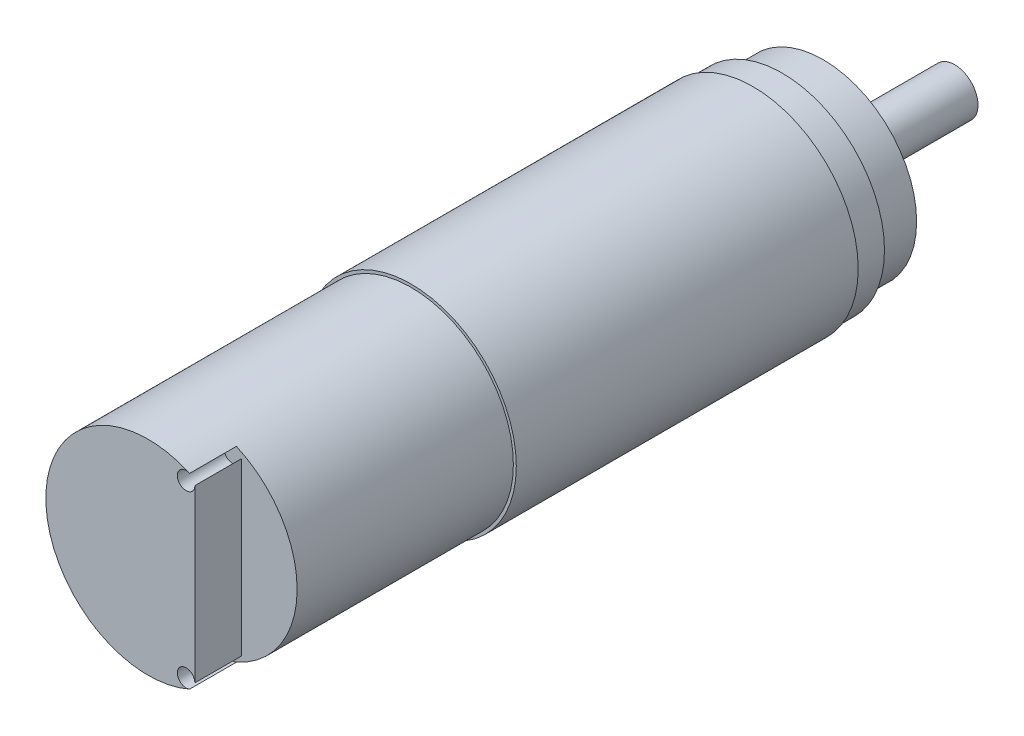
ISO-10303-21;
HEADER;
FILE_DESCRIPTION(('STEP AP214'),'2;1');
FILE_NAME('part.step','',(''),(''),'','','');
FILE_SCHEMA(('AUTOMOTIVE_DESIGN { 1 0 10303 214 1 1 1 1 }'));
ENDSEC;
DATA;
#1=APPLICATION_CONTEXT('core data for automotive mechanical design processes');
#2=APPLICATION_PROTOCOL_DEFINITION('international standard','automotive_design',2000,#1);
#3=PRODUCT_CONTEXT('',#1,'mechanical');
#4=PRODUCT('Part','Part','',(#3));
#5=PRODUCT_RELATED_PRODUCT_CATEGORY('part','',(#4));
#6=PRODUCT_DEFINITION_FORMATION('','',#4);
#7=PRODUCT_DEFINITION_CONTEXT('part definition',#1,'design');
#8=PRODUCT_DEFINITION('design','',#6,#7);
#9=PRODUCT_DEFINITION_SHAPE('','',#8);
#10=(LENGTH_UNIT() NAMED_UNIT(*) SI_UNIT(.MILLI.,.METRE.));
#11=(NAMED_UNIT(*) PLANE_ANGLE_UNIT() SI_UNIT($,.RADIAN.));
#12=(NAMED_UNIT(*) SI_UNIT($,.STERADIAN.) SOLID_ANGLE_UNIT());
#13=UNCERTAINTY_MEASURE_WITH_UNIT(LENGTH_MEASURE(1.E-05),#10,'distance_accuracy_value','');
#14=(GEOMETRIC_REPRESENTATION_CONTEXT(3) GLOBAL_UNCERTAINTY_ASSIGNED_CONTEXT((#13)) GLOBAL_UNIT_ASSIGNED_CONTEXT((#10,
#11,#12)) REPRESENTATION_CONTEXT('',''));
#15=CARTESIAN_POINT('',(0.,0.,0.));
#16=DIRECTION('',(0.,0.,1.));
#17=DIRECTION('',(1.,0.,0.));
#18=AXIS2_PLACEMENT_3D('',#15,#16,#17);
#19=CARTESIAN_POINT('',(0.,0.,115.5));
#20=DIRECTION('',(0.,0.,-1.));
#21=DIRECTION('',(-1.,0.,0.));
#22=AXIS2_PLACEMENT_3D('',#19,#20,#21);
#23=CYLINDRICAL_SURFACE('',#22,17.5);
#24=CARTESIAN_POINT('',(0.,0.,70.5));
#25=DIRECTION('',(0.,0.,1.));
#26=DIRECTION('',(1.,0.,0.));
#27=AXIS2_PLACEMENT_3D('',#24,#25,#26);
#28=CIRCLE('',#27,17.5);
#29=CARTESIAN_POINT('',(17.5,0.,70.5));
#30=VERTEX_POINT('',#29);
#31=EDGE_CURVE('E201',#30,#30,#28,.T.);
#32=ORIENTED_EDGE('',*,*,#31,.T.);
#33=EDGE_LOOP('',(#32));
#34=FACE_BOUND('',#33,.T.);
#35=DIRECTION('',(0.,0.,1.));
#36=VECTOR('',#35,1.);
#37=CARTESIAN_POINT('',(7.109375,15.9908344719522,103.257359312881));
#38=LINE('',#37,#36);
#39=CARTESIAN_POINT('',(7.109375,15.9908344719522,107.5));
#40=VERTEX_POINT('',#39);
#41=CARTESIAN_POINT('',(7.109375,15.9908344719522,115.5));
#42=VERTEX_POINT('',#41);
#43=EDGE_CURVE('E171',#40,#42,#38,.T.);
#44=ORIENTED_EDGE('',*,*,#43,.F.);
#45=CARTESIAN_POINT('',(0.,0.,107.5));
#46=DIRECTION('',(0.,0.,1.));
#47=DIRECTION('',(1.,0.,0.));
#48=AXIS2_PLACEMENT_3D('',#45,#46,#47);
#49=CIRCLE('',#48,17.5);
#50=CARTESIAN_POINT('',(7.109375,-15.9908344719522,107.5));
#51=VERTEX_POINT('',#50);
#52=EDGE_CURVE('E150',#51,#40,#49,.T.);
#53=ORIENTED_EDGE('',*,*,#52,.F.);
#54=DIRECTION('',(0.,0.,1.));
#55=VECTOR('',#54,1.);
#56=CARTESIAN_POINT('',(7.109375,-15.9908344719522,103.257359312881));
#57=LINE('',#56,#55);
#58=CARTESIAN_POINT('',(7.109375,-15.9908344719522,115.5));
#59=VERTEX_POINT('',#58);
#60=EDGE_CURVE('E453',#51,#59,#57,.T.);
#61=ORIENTED_EDGE('',*,*,#60,.T.);
#62=CARTESIAN_POINT('',(0.,0.,115.5));
#63=DIRECTION('',(0.,0.,1.));
#64=DIRECTION('',(1.,0.,0.));
#65=AXIS2_PLACEMENT_3D('',#62,#63,#64);
#66=CIRCLE('',#65,17.5);
#67=EDGE_CURVE('E209',#42,#59,#66,.T.);
#68=ORIENTED_EDGE('',*,*,#67,.F.);
#69=EDGE_LOOP('',(#44,#53,#61,#68));
#70=FACE_BOUND('',#69,.T.);
#71=ADVANCED_FACE('F127',(#34,#70),#23,.T.);
#72=CARTESIAN_POINT('',(8.,15.5643824162734,107.5));
#73=DIRECTION('',(-1.,0.,0.));
#74=DIRECTION('',(0.,0.,1.));
#75=AXIS2_PLACEMENT_3D('',#72,#73,#74);
#76=PLANE('',#75);
#77=DIRECTION('',(0.,-1.,0.));
#78=VECTOR('',#77,1.);
#79=CARTESIAN_POINT('',(8.,15.5643824162734,107.5));
#80=LINE('',#79,#78);
#81=CARTESIAN_POINT('',(8.,14.6201915172135,107.5));
#82=VERTEX_POINT('',#81);
#83=CARTESIAN_POINT('',(8.,-14.6201915172135,107.5));
#84=VERTEX_POINT('',#83);
#85=EDGE_CURVE('E185',#82,#84,#80,.T.);
#86=ORIENTED_EDGE('',*,*,#85,.F.);
#87=DIRECTION('',(0.,0.,1.));
#88=VECTOR('',#87,1.);
#89=CARTESIAN_POINT('',(8.,14.6201915172135,103.257359312881));
#90=LINE('',#89,#88);
#91=CARTESIAN_POINT('',(8.,14.6201915172135,115.5));
#92=VERTEX_POINT('',#91);
#93=EDGE_CURVE('E142',#82,#92,#90,.T.);
#94=ORIENTED_EDGE('',*,*,#93,.T.);
#95=DIRECTION('',(0.,-1.,0.));
#96=VECTOR('',#95,1.);
#97=CARTESIAN_POINT('',(8.,15.5643824162734,115.5));
#98=LINE('',#97,#96);
#99=CARTESIAN_POINT('',(8.,-14.6201915172135,115.5));
#100=VERTEX_POINT('',#99);
#101=EDGE_CURVE('E183',#92,#100,#98,.T.);
#102=ORIENTED_EDGE('',*,*,#101,.T.);
#103=DIRECTION('',(0.,0.,1.));
#104=VECTOR('',#103,1.);
#105=CARTESIAN_POINT('',(8.,-14.6201915172135,103.257359312881));
#106=LINE('',#105,#104);
#107=EDGE_CURVE('E452',#84,#100,#106,.T.);
#108=ORIENTED_EDGE('',*,*,#107,.F.);
#109=EDGE_LOOP('',(#86,#94,#102,#108));
#110=FACE_BOUND('',#109,.T.);
#111=ADVANCED_FACE('F181',(#110),#76,.F.);
#112=CARTESIAN_POINT('',(0.,0.,7.));
#113=DIRECTION('',(0.,0.,1.));
#114=DIRECTION('',(1.,0.,0.));
#115=AXIS2_PLACEMENT_3D('',#112,#113,#114);
#116=CIRCLE('',#115,17.5);
#117=CARTESIAN_POINT('',(17.5,0.,7.));
#118=VERTEX_POINT('',#117);
#119=EDGE_CURVE('E208',#118,#118,#116,.T.);
#120=ORIENTED_EDGE('',*,*,#119,.T.);
#121=EDGE_LOOP('',(#120));
#122=FACE_BOUND('',#121,.T.);
#123=CARTESIAN_POINT('',(0.,0.,12.));
#124=DIRECTION('',(0.,0.,1.));
#125=DIRECTION('',(1.,0.,0.));
#126=AXIS2_PLACEMENT_3D('',#123,#124,#125);
#127=CIRCLE('',#126,17.5);
#128=CARTESIAN_POINT('',(17.5,0.,12.));
#129=VERTEX_POINT('',#128);
#130=EDGE_CURVE('E13',#129,#129,#127,.T.);
#131=ORIENTED_EDGE('',*,*,#130,.F.);
#132=EDGE_LOOP('',(#131));
#133=FACE_BOUND('',#132,.T.);
#134=ADVANCED_FACE('F252',(#122,#133),#23,.T.);
#135=CARTESIAN_POINT('',(-9.89949493661172,9.89949493661161,7.));
#136=DIRECTION('',(0.,0.,-1.));
#137=DIRECTION('',(-1.,0.,0.));
#138=AXIS2_PLACEMENT_3D('',#135,#136,#137);
#139=CYLINDRICAL_SURFACE('',#138,1.75);
#140=CARTESIAN_POINT('',(-9.89949493661172,9.89949493661161,7.));
#141=DIRECTION('',(0.,0.,1.));
#142=DIRECTION('',(1.,0.,0.));
#143=AXIS2_PLACEMENT_3D('',#140,#141,#142);
#144=CIRCLE('',#143,1.75);
#145=CARTESIAN_POINT('',(-8.14949493661172,9.89949493661161,7.));
#146=VERTEX_POINT('',#145);
#147=EDGE_CURVE('E218',#146,#146,#144,.T.);
#148=ORIENTED_EDGE('',*,*,#147,.T.);
#149=EDGE_LOOP('',(#148));
#150=FACE_BOUND('',#149,.T.);
#151=CARTESIAN_POINT('',(-9.89949493661172,9.89949493661161,0.));
#152=DIRECTION('',(0.,0.,1.));
#153=DIRECTION('',(1.,0.,0.));
#154=AXIS2_PLACEMENT_3D('',#151,#152,#153);
#155=CIRCLE('',#154,1.75);
#156=CARTESIAN_POINT('',(-8.14949493661172,9.89949493661161,0.));
#157=VERTEX_POINT('',#156);
#158=EDGE_CURVE('E232',#157,#157,#155,.T.);
#159=ORIENTED_EDGE('',*,*,#158,.F.);
#160=EDGE_LOOP('',(#159));
#161=FACE_BOUND('',#160,.T.);
#162=ADVANCED_FACE('F250',(#150,#161),#139,.F.);
#163=CARTESIAN_POINT('',(0.,0.,0.));
#164=DIRECTION('',(0.,0.,1.));
#165=DIRECTION('',(1.,0.,0.));
#166=AXIS2_PLACEMENT_3D('',#163,#164,#165);
#167=PLANE('',#166);
#168=CARTESIAN_POINT('',(0.,0.,0.));
#169=DIRECTION('',(0.,0.,1.));
#170=DIRECTION('',(1.,0.,0.));
#171=AXIS2_PLACEMENT_3D('',#168,#169,#170);
#172=CIRCLE('',#171,4.);
#173=CARTESIAN_POINT('',(4.,0.,0.));
#174=VERTEX_POINT('',#173);
#175=EDGE_CURVE('E135',#174,#174,#172,.F.);
#176=ORIENTED_EDGE('',*,*,#175,.F.);
#177=EDGE_LOOP('',(#176));
#178=FACE_BOUND('',#177,.T.);
#179=CARTESIAN_POINT('',(9.89949493661161,9.89949493661172,0.));
#180=DIRECTION('',(0.,0.,1.));
#181=DIRECTION('',(1.,0.,0.));
#182=AXIS2_PLACEMENT_3D('',#179,#180,#181);
#183=CIRCLE('',#182,1.75);
#184=CARTESIAN_POINT('',(11.6494949366116,9.89949493661172,0.));
#185=VERTEX_POINT('',#184);
#186=EDGE_CURVE('E217',#185,#185,#183,.T.);
#187=ORIENTED_EDGE('',*,*,#186,.T.);
#188=EDGE_LOOP('',(#187));
#189=FACE_BOUND('',#188,.T.);
#190=ORIENTED_EDGE('',*,*,#158,.T.);
#191=EDGE_LOOP('',(#190));
#192=FACE_BOUND('',#191,.T.);
#193=CARTESIAN_POINT('',(-9.89949493661161,-9.89949493661172,0.));
#194=DIRECTION('',(0.,0.,1.));
#195=DIRECTION('',(1.,0.,0.));
#196=AXIS2_PLACEMENT_3D('',#193,#194,#195);
#197=CIRCLE('',#196,1.75);
#198=CARTESIAN_POINT('',(-8.14949493661161,-9.89949493661172,0.));
#199=VERTEX_POINT('',#198);
#200=EDGE_CURVE('E235',#199,#199,#197,.T.);
#201=ORIENTED_EDGE('',*,*,#200,.T.);
#202=EDGE_LOOP('',(#201));
#203=FACE_BOUND('',#202,.T.);
#204=CARTESIAN_POINT('',(9.89949493661172,-9.89949493661161,0.));
#205=DIRECTION('',(0.,0.,1.));
#206=DIRECTION('',(1.,0.,0.));
#207=AXIS2_PLACEMENT_3D('',#204,#205,#206);
#208=CIRCLE('',#207,1.75);
#209=CARTESIAN_POINT('',(11.6494949366117,-9.89949493661161,0.));
#210=VERTEX_POINT('',#209);
#211=EDGE_CURVE('E238',#210,#210,#208,.T.);
#212=ORIENTED_EDGE('',*,*,#211,.T.);
#213=EDGE_LOOP('',(#212));
#214=FACE_BOUND('',#213,.T.);
#215=CARTESIAN_POINT('',(0.,0.,0.));
#216=DIRECTION('',(0.,0.,1.));
#217=DIRECTION('',(1.,0.,0.));
#218=AXIS2_PLACEMENT_3D('',#215,#216,#217);
#219=CIRCLE('',#218,16.);
#220=CARTESIAN_POINT('',(16.,0.,0.));
#221=VERTEX_POINT('',#220);
#222=EDGE_CURVE('E229',#221,#221,#219,.T.);
#223=ORIENTED_EDGE('',*,*,#222,.F.);
#224=EDGE_LOOP('',(#223));
#225=FACE_BOUND('',#224,.T.);
#226=ADVANCED_FACE('F247',(#178,#189,#192,#203,#214,#225),#167,.F.);
#227=CARTESIAN_POINT('',(9.89949493661161,9.89949493661172,7.));
#228=DIRECTION('',(0.,0.,-1.));
#229=DIRECTION('',(-1.,0.,0.));
#230=AXIS2_PLACEMENT_3D('',#227,#228,#229);
#231=CYLINDRICAL_SURFACE('',#230,1.75);
#232=CARTESIAN_POINT('',(9.89949493661161,9.89949493661172,7.));
#233=DIRECTION('',(0.,0.,1.));
#234=DIRECTION('',(1.,0.,0.));
#235=AXIS2_PLACEMENT_3D('',#232,#233,#234);
#236=CIRCLE('',#235,1.75);
#237=CARTESIAN_POINT('',(11.6494949366116,9.89949493661172,7.));
#238=VERTEX_POINT('',#237);
#239=EDGE_CURVE('E214',#238,#238,#236,.T.);
#240=ORIENTED_EDGE('',*,*,#239,.T.);
#241=EDGE_LOOP('',(#240));
#242=FACE_BOUND('',#241,.T.);
#243=ORIENTED_EDGE('',*,*,#186,.F.);
#244=EDGE_LOOP('',(#243));
#245=FACE_BOUND('',#244,.T.);
#246=ADVANCED_FACE('F129',(#242,#245),#231,.F.);
#247=CARTESIAN_POINT('',(9.89949493661172,-9.89949493661161,7.));
#248=DIRECTION('',(0.,0.,-1.));
#249=DIRECTION('',(-1.,0.,0.));
#250=AXIS2_PLACEMENT_3D('',#247,#248,#249);
#251=CYLINDRICAL_SURFACE('',#250,1.75);
#252=CARTESIAN_POINT('',(9.89949493661172,-9.89949493661161,7.));
#253=DIRECTION('',(0.,0.,1.));
#254=DIRECTION('',(1.,0.,0.));
#255=AXIS2_PLACEMENT_3D('',#252,#253,#254);
#256=CIRCLE('',#255,1.75);
#257=CARTESIAN_POINT('',(11.6494949366117,-9.89949493661161,7.));
#258=VERTEX_POINT('',#257);
#259=EDGE_CURVE('E211',#258,#258,#256,.T.);
#260=ORIENTED_EDGE('',*,*,#259,.T.);
#261=EDGE_LOOP('',(#260));
#262=FACE_BOUND('',#261,.T.);
#263=ORIENTED_EDGE('',*,*,#211,.F.);
#264=EDGE_LOOP('',(#263));
#265=FACE_BOUND('',#264,.T.);
#266=ADVANCED_FACE('F277',(#262,#265),#251,.F.);
#267=CARTESIAN_POINT('',(-9.89949493661161,-9.89949493661172,7.));
#268=DIRECTION('',(0.,0.,-1.));
#269=DIRECTION('',(-1.,0.,0.));
#270=AXIS2_PLACEMENT_3D('',#267,#268,#269);
#271=CYLINDRICAL_SURFACE('',#270,1.75);
#272=CARTESIAN_POINT('',(-9.89949493661161,-9.89949493661172,7.));
#273=DIRECTION('',(0.,0.,1.));
#274=DIRECTION('',(1.,0.,0.));
#275=AXIS2_PLACEMENT_3D('',#272,#273,#274);
#276=CIRCLE('',#275,1.75);
#277=CARTESIAN_POINT('',(-8.14949493661161,-9.89949493661172,7.));
#278=VERTEX_POINT('',#277);
#279=EDGE_CURVE('E221',#278,#278,#276,.T.);
#280=ORIENTED_EDGE('',*,*,#279,.T.);
#281=EDGE_LOOP('',(#280));
#282=FACE_BOUND('',#281,.T.);
#283=ORIENTED_EDGE('',*,*,#200,.F.);
#284=EDGE_LOOP('',(#283));
#285=FACE_BOUND('',#284,.T.);
#286=ADVANCED_FACE('F266',(#282,#285),#271,.F.);
#287=CARTESIAN_POINT('',(0.,0.,7.));
#288=DIRECTION('',(0.,0.,-1.));
#289=DIRECTION('',(-1.,0.,0.));
#290=AXIS2_PLACEMENT_3D('',#287,#288,#289);
#291=CYLINDRICAL_SURFACE('',#290,16.);
#292=CARTESIAN_POINT('',(0.,0.,7.));
#293=DIRECTION('',(0.,0.,1.));
#294=DIRECTION('',(1.,0.,0.));
#295=AXIS2_PLACEMENT_3D('',#292,#293,#294);
#296=CIRCLE('',#295,16.);
#297=CARTESIAN_POINT('',(16.,0.,7.));
#298=VERTEX_POINT('',#297);
#299=EDGE_CURVE('E226',#298,#298,#296,.T.);
#300=ORIENTED_EDGE('',*,*,#299,.F.);
#301=EDGE_LOOP('',(#300));
#302=FACE_BOUND('',#301,.T.);
#303=ORIENTED_EDGE('',*,*,#222,.T.);
#304=EDGE_LOOP('',(#303));
#305=FACE_BOUND('',#304,.T.);
#306=ADVANCED_FACE('F263',(#302,#305),#291,.T.);
#307=CARTESIAN_POINT('',(0.,0.,7.));
#308=DIRECTION('',(0.,0.,1.));
#309=DIRECTION('',(1.,0.,0.));
#310=AXIS2_PLACEMENT_3D('',#307,#308,#309);
#311=PLANE('',#310);
#312=ORIENTED_EDGE('',*,*,#299,.T.);
#313=EDGE_LOOP('',(#312));
#314=FACE_BOUND('',#313,.T.);
#315=ORIENTED_EDGE('',*,*,#119,.F.);
#316=EDGE_LOOP('',(#315));
#317=FACE_BOUND('',#316,.T.);
#318=ADVANCED_FACE('F265',(#314,#317),#311,.F.);
#319=ORIENTED_EDGE('',*,*,#259,.F.);
#320=EDGE_LOOP('',(#319));
#321=FACE_BOUND('',#320,.T.);
#322=ADVANCED_FACE('F273',(#321),#311,.F.);
#323=ORIENTED_EDGE('',*,*,#279,.F.);
#324=EDGE_LOOP('',(#323));
#325=FACE_BOUND('',#324,.T.);
#326=ADVANCED_FACE('F333',(#325),#311,.F.);
#327=ORIENTED_EDGE('',*,*,#147,.F.);
#328=EDGE_LOOP('',(#327));
#329=FACE_BOUND('',#328,.T.);
#330=ADVANCED_FACE('F327',(#329),#311,.F.);
#331=ORIENTED_EDGE('',*,*,#239,.F.);
#332=EDGE_LOOP('',(#331));
#333=FACE_BOUND('',#332,.T.);
#334=ADVANCED_FACE('F276',(#333),#311,.F.);
#335=CARTESIAN_POINT('',(0.,0.,-22.5));
#336=DIRECTION('',(0.,0.,1.));
#337=DIRECTION('',(1.,0.,0.));
#338=AXIS2_PLACEMENT_3D('',#335,#336,#337);
#339=CYLINDRICAL_SURFACE('',#338,4.);
#340=CARTESIAN_POINT('',(0.,0.,-22.5));
#341=DIRECTION('',(0.,0.,-1.));
#342=DIRECTION('',(-1.,0.,0.));
#343=AXIS2_PLACEMENT_3D('',#340,#341,#342);
#344=CIRCLE('',#343,4.);
#345=CARTESIAN_POINT('',(4.,0.,-22.5));
#346=VERTEX_POINT('',#345);
#347=EDGE_CURVE('E199',#346,#346,#344,.T.);
#348=CARTESIAN_POINT('',(4.,0.,-22.5));
#349=CARTESIAN_POINT('',(4.,0.,-22.265625));
#350=CARTESIAN_POINT('',(4.,0.,-22.03125));
#351=CARTESIAN_POINT('',(4.,0.,-21.5625));
#352=CARTESIAN_POINT('',(4.,0.,-21.328125));
#353=CARTESIAN_POINT('',(4.,0.,-20.859375));
#354=CARTESIAN_POINT('',(4.,0.,-20.625));
#355=CARTESIAN_POINT('',(4.,0.,-20.15625));
#356=CARTESIAN_POINT('',(4.,0.,-19.921875));
#357=CARTESIAN_POINT('',(4.,0.,-19.453125));
#358=CARTESIAN_POINT('',(4.,0.,-19.21875));
#359=CARTESIAN_POINT('',(4.,0.,-18.75));
#360=CARTESIAN_POINT('',(4.,0.,-18.515625));
#361=CARTESIAN_POINT('',(4.,0.,-18.046875));
#362=CARTESIAN_POINT('',(4.,0.,-17.8125));
#363=CARTESIAN_POINT('',(4.,0.,-17.34375));
#364=CARTESIAN_POINT('',(4.,0.,-17.109375));
#365=CARTESIAN_POINT('',(4.,0.,-16.640625));
#366=CARTESIAN_POINT('',(4.,0.,-16.40625));
#367=CARTESIAN_POINT('',(4.,0.,-15.9375));
#368=CARTESIAN_POINT('',(4.,0.,-15.703125));
#369=CARTESIAN_POINT('',(4.,0.,-15.234375));
#370=CARTESIAN_POINT('',(4.,0.,-15.));
#371=CARTESIAN_POINT('',(4.,0.,-14.53125));
#372=CARTESIAN_POINT('',(4.,0.,-14.296875));
#373=CARTESIAN_POINT('',(4.,0.,-13.828125));
#374=CARTESIAN_POINT('',(4.,0.,-13.59375));
#375=CARTESIAN_POINT('',(4.,0.,-13.125));
#376=CARTESIAN_POINT('',(4.,0.,-12.890625));
#377=CARTESIAN_POINT('',(4.,0.,-12.421875));
#378=CARTESIAN_POINT('',(4.,0.,-12.1875));
#379=CARTESIAN_POINT('',(4.,0.,-11.71875));
#380=CARTESIAN_POINT('',(4.,0.,-11.484375));
#381=CARTESIAN_POINT('',(4.,0.,-11.015625));
#382=CARTESIAN_POINT('',(4.,0.,-10.78125));
#383=CARTESIAN_POINT('',(4.,0.,-10.3125));
#384=CARTESIAN_POINT('',(4.,0.,-10.078125));
#385=CARTESIAN_POINT('',(4.,0.,-9.609375));
#386=CARTESIAN_POINT('',(4.,0.,-9.375));
#387=CARTESIAN_POINT('',(4.,0.,-8.90625));
#388=CARTESIAN_POINT('',(4.,0.,-8.671875));
#389=CARTESIAN_POINT('',(4.,0.,-8.203125));
#390=CARTESIAN_POINT('',(4.,0.,-7.96875));
#391=CARTESIAN_POINT('',(4.,0.,-7.5));
#392=CARTESIAN_POINT('',(4.,0.,-7.265625));
#393=CARTESIAN_POINT('',(4.,0.,-6.796875));
#394=CARTESIAN_POINT('',(4.,0.,-6.5625));
#395=CARTESIAN_POINT('',(4.,0.,-6.09375));
#396=CARTESIAN_POINT('',(4.,0.,-5.859375));
#397=CARTESIAN_POINT('',(4.,0.,-5.390625));
#398=CARTESIAN_POINT('',(4.,0.,-5.15625));
#399=CARTESIAN_POINT('',(4.,0.,-4.6875));
#400=CARTESIAN_POINT('',(4.,0.,-4.453125));
#401=CARTESIAN_POINT('',(4.,0.,-3.984375));
#402=CARTESIAN_POINT('',(4.,0.,-3.75));
#403=CARTESIAN_POINT('',(4.,0.,-3.28125));
#404=CARTESIAN_POINT('',(4.,0.,-3.046875));
#405=CARTESIAN_POINT('',(4.,0.,-2.578125));
#406=CARTESIAN_POINT('',(4.,0.,-2.34375));
#407=CARTESIAN_POINT('',(4.,0.,-1.875));
#408=CARTESIAN_POINT('',(4.,0.,-1.640625));
#409=CARTESIAN_POINT('',(4.,0.,-1.171875));
#410=CARTESIAN_POINT('',(4.,0.,-0.937500000000003));
#411=CARTESIAN_POINT('',(4.,0.,-0.468750000000003));
#412=CARTESIAN_POINT('',(4.,0.,-0.234375000000003));
#413=CARTESIAN_POINT('',(4.,0.,0.));
#414=B_SPLINE_CURVE_WITH_KNOTS('',3,(#348,#349,#350,#351,#352,#353,#354,#355,#356,#357,#358,
#359,#360,#361,#362,#363,#364,#365,#366,#367,#368,#369,#370,#371,#372,#373,#374,#375,#376,#377,
#378,#379,#380,#381,#382,#383,#384,#385,#386,#387,#388,#389,#390,#391,#392,#393,#394,#395,#396,
#397,#398,#399,#400,#401,#402,#403,#404,#405,#406,#407,#408,#409,#410,#411,#412,#413),
.UNSPECIFIED.,.F.,.F.,(4,2,2,2,2,2,2,2,2,2,2,2,2,2,2,2,2,2,2,2,2,2,2,2,2,2,2,2,2,2,2,2,4),(0.,
0.703125000000002,1.40625,2.109375,2.8125,3.515625,4.21875,4.921875,5.625,6.328125,7.03125,
7.734375,8.4375,9.140625,9.84375,10.546875,11.25,11.953125,12.65625,13.359375,14.0625,14.765625,
15.46875,16.171875,16.875,17.578125,18.28125,18.984375,19.6875,20.390625,21.09375,21.796875,
22.5),.UNSPECIFIED.);
#415=EDGE_CURVE('BSEAM245',#346,#174,#414,.T.);
#416=ORIENTED_EDGE('',*,*,#347,.F.);
#417=ORIENTED_EDGE('',*,*,#175,.T.);
#418=ORIENTED_EDGE('',*,*,#415,.T.);
#419=ORIENTED_EDGE('',*,*,#415,.F.);
#420=EDGE_LOOP('',(#416,#418,#417,#419));
#421=FACE_BOUND('',#420,.T.);
#422=ADVANCED_FACE('F245',(#421),#339,.T.);
#423=CARTESIAN_POINT('',(0.,0.,-22.5));
#424=DIRECTION('',(0.,0.,-1.));
#425=DIRECTION('',(-1.,0.,0.));
#426=AXIS2_PLACEMENT_3D('',#423,#424,#425);
#427=PLANE('',#426);
#428=ORIENTED_EDGE('',*,*,#347,.T.);
#429=EDGE_LOOP('',(#428));
#430=FACE_BOUND('',#429,.T.);
#431=ADVANCED_FACE('F317',(#430),#427,.T.);
#432=CARTESIAN_POINT('',(0.,0.,-43.9116882454314));
#433=DIRECTION('',(0.,0.,1.));
#434=DIRECTION('',(1.,0.,0.));
#435=AXIS2_PLACEMENT_3D('',#432,#433,#434);
#436=CYLINDRICAL_SURFACE('',#435,18.);
#437=CARTESIAN_POINT('',(0.,0.,12.));
#438=DIRECTION('',(0.,0.,1.));
#439=DIRECTION('',(1.,0.,0.));
#440=AXIS2_PLACEMENT_3D('',#437,#438,#439);
#441=CIRCLE('',#440,18.);
#442=CARTESIAN_POINT('',(18.,0.,12.));
#443=VERTEX_POINT('',#442);
#444=EDGE_CURVE('E196',#443,#443,#441,.F.);
#445=ORIENTED_EDGE('',*,*,#444,.F.);
#446=EDGE_LOOP('',(#445));
#447=FACE_BOUND('',#446,.T.);
#448=CARTESIAN_POINT('',(0.,0.,70.5));
#449=DIRECTION('',(0.,0.,1.));
#450=DIRECTION('',(1.,0.,0.));
#451=AXIS2_PLACEMENT_3D('',#448,#449,#450);
#452=CIRCLE('',#451,18.);
#453=CARTESIAN_POINT('',(18.,0.,70.5));
#454=VERTEX_POINT('',#453);
#455=EDGE_CURVE('E200',#454,#454,#452,.T.);
#456=ORIENTED_EDGE('',*,*,#455,.F.);
#457=EDGE_LOOP('',(#456));
#458=FACE_BOUND('',#457,.T.);
#459=ADVANCED_FACE('F310',(#447,#458),#436,.T.);
#460=CARTESIAN_POINT('',(0.,0.,70.5));
#461=DIRECTION('',(0.,0.,1.));
#462=DIRECTION('',(1.,0.,0.));
#463=AXIS2_PLACEMENT_3D('',#460,#461,#462);
#464=PLANE('',#463);
#465=ORIENTED_EDGE('',*,*,#31,.F.);
#466=EDGE_LOOP('',(#465));
#467=FACE_BOUND('',#466,.T.);
#468=ORIENTED_EDGE('',*,*,#455,.T.);
#469=EDGE_LOOP('',(#468));
#470=FACE_BOUND('',#469,.T.);
#471=ADVANCED_FACE('F301',(#467,#470),#464,.T.);
#472=CARTESIAN_POINT('',(0.,0.,12.));
#473=DIRECTION('',(0.,0.,1.));
#474=DIRECTION('',(1.,0.,0.));
#475=AXIS2_PLACEMENT_3D('',#472,#473,#474);
#476=PLANE('',#475);
#477=ORIENTED_EDGE('',*,*,#444,.T.);
#478=EDGE_LOOP('',(#477));
#479=FACE_BOUND('',#478,.T.);
#480=ORIENTED_EDGE('',*,*,#130,.T.);
#481=EDGE_LOOP('',(#480));
#482=FACE_BOUND('',#481,.T.);
#483=ADVANCED_FACE('F299',(#479,#482),#476,.F.);
#484=CARTESIAN_POINT('',(0.,0.,115.5));
#485=DIRECTION('',(0.,0.,1.));
#486=DIRECTION('',(1.,0.,0.));
#487=AXIS2_PLACEMENT_3D('',#484,#485,#486);
#488=PLANE('',#487);
#489=CARTESIAN_POINT('',(6.5,14.6201915172135,115.5));
#490=DIRECTION('',(0.,0.,1.));
#491=DIRECTION('',(1.,0.,0.));
#492=AXIS2_PLACEMENT_3D('',#489,#490,#491);
#493=CIRCLE('',#492,1.5);
#494=EDGE_CURVE('E169',#42,#92,#493,.T.);
#495=ORIENTED_EDGE('',*,*,#494,.F.);
#496=ORIENTED_EDGE('',*,*,#67,.T.);
#497=CARTESIAN_POINT('',(6.5,-14.6201915172135,115.5));
#498=DIRECTION('',(0.,0.,1.));
#499=DIRECTION('',(-1.,0.,0.));
#500=AXIS2_PLACEMENT_3D('',#497,#498,#499);
#501=CIRCLE('',#500,1.5);
#502=EDGE_CURVE('E189',#100,#59,#501,.T.);
#503=ORIENTED_EDGE('',*,*,#502,.F.);
#504=ORIENTED_EDGE('',*,*,#101,.F.);
#505=EDGE_LOOP('',(#495,#496,#503,#504));
#506=FACE_BOUND('',#505,.T.);
#507=ADVANCED_FACE('F188',(#506),#488,.T.);
#508=CARTESIAN_POINT('',(0.,0.,107.5));
#509=DIRECTION('',(0.,0.,1.));
#510=DIRECTION('',(1.,0.,0.));
#511=AXIS2_PLACEMENT_3D('',#508,#509,#510);
#512=PLANE('',#511);
#513=ORIENTED_EDGE('',*,*,#52,.T.);
#514=CARTESIAN_POINT('',(6.5,14.6201915172135,107.5));
#515=DIRECTION('',(0.,0.,1.));
#516=DIRECTION('',(1.,0.,0.));
#517=AXIS2_PLACEMENT_3D('',#514,#515,#516);
#518=CIRCLE('',#517,1.5);
#519=EDGE_CURVE('E190',#82,#40,#518,.F.);
#520=ORIENTED_EDGE('',*,*,#519,.F.);
#521=ORIENTED_EDGE('',*,*,#85,.T.);
#522=CARTESIAN_POINT('',(6.5,-14.6201915172135,107.5));
#523=DIRECTION('',(0.,0.,1.));
#524=DIRECTION('',(1.,0.,0.));
#525=AXIS2_PLACEMENT_3D('',#522,#523,#524);
#526=CIRCLE('',#525,1.5);
#527=EDGE_CURVE('E176',#51,#84,#526,.F.);
#528=ORIENTED_EDGE('',*,*,#527,.F.);
#529=EDGE_LOOP('',(#513,#520,#521,#528));
#530=FACE_BOUND('',#529,.T.);
#531=ADVANCED_FACE('F308',(#530),#512,.T.);
#532=CARTESIAN_POINT('',(6.5,-14.6201915172135,103.257359312881));
#533=DIRECTION('',(0.,0.,1.));
#534=DIRECTION('',(1.,0.,0.));
#535=AXIS2_PLACEMENT_3D('',#532,#533,#534);
#536=CYLINDRICAL_SURFACE('',#535,1.5);
#537=ORIENTED_EDGE('',*,*,#527,.T.);
#538=ORIENTED_EDGE('',*,*,#107,.T.);
#539=ORIENTED_EDGE('',*,*,#502,.T.);
#540=ORIENTED_EDGE('',*,*,#60,.F.);
#541=EDGE_LOOP('',(#537,#538,#539,#540));
#542=FACE_BOUND('',#541,.T.);
#543=ADVANCED_FACE('F431',(#542),#536,.F.);
#544=CARTESIAN_POINT('',(6.5,14.6201915172135,103.257359312881));
#545=DIRECTION('',(0.,0.,1.));
#546=DIRECTION('',(1.,0.,0.));
#547=AXIS2_PLACEMENT_3D('',#544,#545,#546);
#548=CYLINDRICAL_SURFACE('',#547,1.5);
#549=ORIENTED_EDGE('',*,*,#519,.T.);
#550=ORIENTED_EDGE('',*,*,#43,.T.);
#551=ORIENTED_EDGE('',*,*,#494,.T.);
#552=ORIENTED_EDGE('',*,*,#93,.F.);
#553=EDGE_LOOP('',(#549,#550,#551,#552));
#554=FACE_BOUND('',#553,.T.);
#555=ADVANCED_FACE('F170',(#554),#548,.F.);
#556=CLOSED_SHELL('',(#71,#111,#134,#162,#226,#246,#266,#286,#306,#318,#322,#326,#330,#334,#422,
#431,#459,#471,#483,#507,#531,#543,#555));
#557=MANIFOLD_SOLID_BREP('B2',#556);
#558=ADVANCED_BREP_SHAPE_REPRESENTATION('',(#18,#557),#14);
#559=SHAPE_DEFINITION_REPRESENTATION(#9,#558);
ENDSEC;
END-ISO-10303-21;
